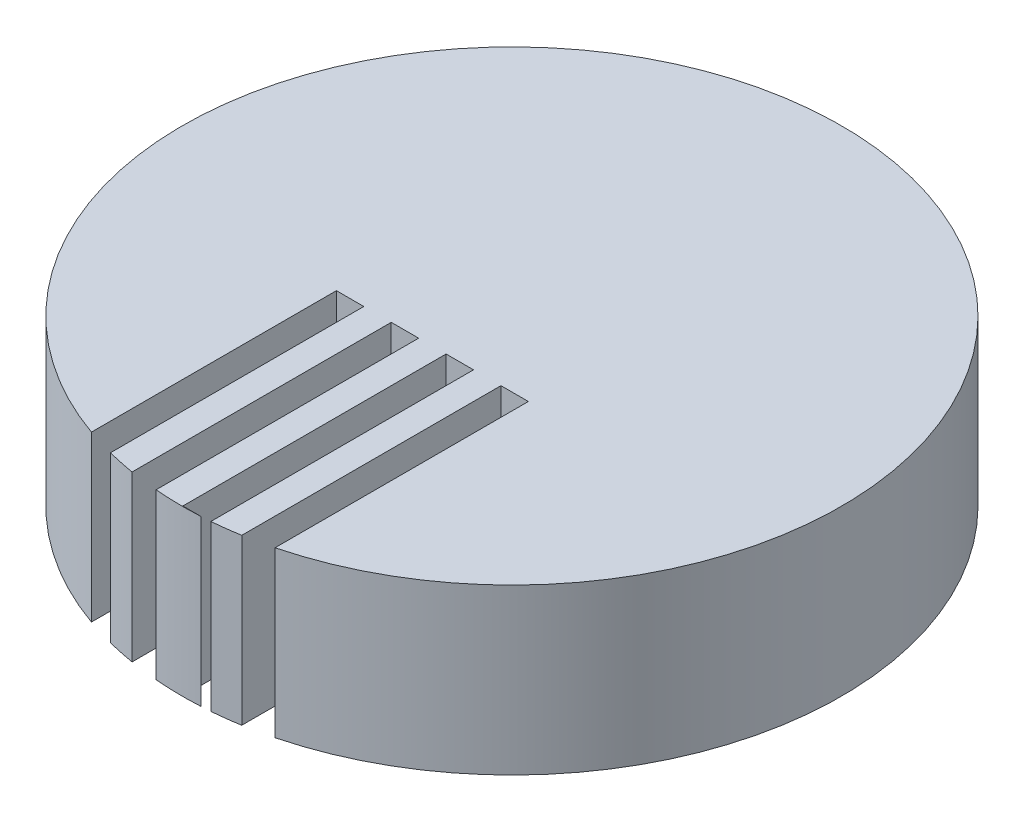
ISO-10303-21;
HEADER;
FILE_DESCRIPTION(('STEP AP214'),'2;1');
FILE_NAME('part.step','',(''),(''),'','','');
FILE_SCHEMA(('AUTOMOTIVE_DESIGN { 1 0 10303 214 1 1 1 1 }'));
ENDSEC;
DATA;
#1=APPLICATION_CONTEXT('core data for automotive mechanical design processes');
#2=APPLICATION_PROTOCOL_DEFINITION('international standard','automotive_design',2000,#1);
#3=PRODUCT_CONTEXT('',#1,'mechanical');
#4=PRODUCT('Part','Part','',(#3));
#5=PRODUCT_RELATED_PRODUCT_CATEGORY('part','',(#4));
#6=PRODUCT_DEFINITION_FORMATION('','',#4);
#7=PRODUCT_DEFINITION_CONTEXT('part definition',#1,'design');
#8=PRODUCT_DEFINITION('design','',#6,#7);
#9=PRODUCT_DEFINITION_SHAPE('','',#8);
#10=(LENGTH_UNIT() NAMED_UNIT(*) SI_UNIT(.MILLI.,.METRE.));
#11=(NAMED_UNIT(*) PLANE_ANGLE_UNIT() SI_UNIT($,.RADIAN.));
#12=(NAMED_UNIT(*) SI_UNIT($,.STERADIAN.) SOLID_ANGLE_UNIT());
#13=UNCERTAINTY_MEASURE_WITH_UNIT(LENGTH_MEASURE(1.E-05),#10,'distance_accuracy_value','');
#14=(GEOMETRIC_REPRESENTATION_CONTEXT(3) GLOBAL_UNCERTAINTY_ASSIGNED_CONTEXT((#13)) GLOBAL_UNIT_ASSIGNED_CONTEXT((#10,
#11,#12)) REPRESENTATION_CONTEXT('',''));
#15=CARTESIAN_POINT('',(0.,0.,0.));
#16=DIRECTION('',(0.,0.,1.));
#17=DIRECTION('',(1.,0.,0.));
#18=AXIS2_PLACEMENT_3D('',#15,#16,#17);
#19=CARTESIAN_POINT('',(0.,38.1,0.));
#20=DIRECTION('',(0.,-1.,0.));
#21=DIRECTION('',(0.,0.,-1.));
#22=AXIS2_PLACEMENT_3D('',#19,#20,#21);
#23=CYLINDRICAL_SURFACE('',#22,76.3165677787455);
#24=CARTESIAN_POINT('',(0.,0.,0.));
#25=DIRECTION('',(0.,1.,0.));
#26=DIRECTION('',(0.,0.,1.));
#27=AXIS2_PLACEMENT_3D('',#24,#25,#26);
#28=CIRCLE('',#27,76.3165677787455);
#29=CARTESIAN_POINT('',(19.05,0.,73.9007173004962));
#30=VERTEX_POINT('',#29);
#31=CARTESIAN_POINT('',(-25.4,0.,71.965675967977));
#32=VERTEX_POINT('',#31);
#33=EDGE_CURVE('E230',#30,#32,#28,.T.);
#34=ORIENTED_EDGE('',*,*,#33,.T.);
#35=DIRECTION('',(0.,1.,0.));
#36=VECTOR('',#35,1.);
#37=CARTESIAN_POINT('',(-25.4,0.,71.965675967977));
#38=LINE('',#37,#36);
#39=CARTESIAN_POINT('',(-25.4,38.1,71.965675967977));
#40=VERTEX_POINT('',#39);
#41=EDGE_CURVE('E378',#32,#40,#38,.T.);
#42=ORIENTED_EDGE('',*,*,#41,.T.);
#43=CARTESIAN_POINT('',(0.,38.1,0.));
#44=DIRECTION('',(0.,1.,0.));
#45=DIRECTION('',(0.,0.,1.));
#46=AXIS2_PLACEMENT_3D('',#43,#44,#45);
#47=CIRCLE('',#46,76.3165677787455);
#48=CARTESIAN_POINT('',(19.05,38.1,73.9007173004962));
#49=VERTEX_POINT('',#48);
#50=EDGE_CURVE('E424',#49,#40,#47,.T.);
#51=ORIENTED_EDGE('',*,*,#50,.F.);
#52=DIRECTION('',(0.,1.,0.));
#53=VECTOR('',#52,1.);
#54=CARTESIAN_POINT('',(19.05,0.,73.9007173004962));
#55=LINE('',#54,#53);
#56=EDGE_CURVE('E331',#30,#49,#55,.T.);
#57=ORIENTED_EDGE('',*,*,#56,.F.);
#58=EDGE_LOOP('',(#34,#42,#51,#57));
#59=FACE_BOUND('',#58,.T.);
#60=ADVANCED_FACE('F39',(#59),#23,.T.);
#61=CARTESIAN_POINT('',(-6.35000000000001,38.1,76.0519297423008));
#62=VERTEX_POINT('',#61);
#63=CARTESIAN_POINT('',(4.2164579362137,38.1,76.2));
#64=VERTEX_POINT('',#63);
#65=EDGE_CURVE('E240',#62,#64,#47,.T.);
#66=ORIENTED_EDGE('',*,*,#65,.F.);
#67=DIRECTION('',(0.,1.,0.));
#68=VECTOR('',#67,1.);
#69=CARTESIAN_POINT('',(-6.35000000000001,0.,76.0519297423008));
#70=LINE('',#69,#68);
#71=CARTESIAN_POINT('',(-6.35000000000001,0.,76.0519297423008));
#72=VERTEX_POINT('',#71);
#73=EDGE_CURVE('E397',#72,#62,#70,.T.);
#74=ORIENTED_EDGE('',*,*,#73,.F.);
#75=CARTESIAN_POINT('',(4.2164579362137,0.,76.2));
#76=VERTEX_POINT('',#75);
#77=EDGE_CURVE('E231',#72,#76,#28,.T.);
#78=ORIENTED_EDGE('',*,*,#77,.T.);
#79=DIRECTION('',(0.,-1.,0.));
#80=VECTOR('',#79,1.);
#81=CARTESIAN_POINT('',(4.21645793621422,38.1,76.2));
#82=LINE('',#81,#80);
#83=EDGE_CURVE('E236',#76,#64,#82,.F.);
#84=ORIENTED_EDGE('',*,*,#83,.T.);
#85=EDGE_LOOP('',(#66,#74,#78,#84));
#86=FACE_BOUND('',#85,.T.);
#87=ADVANCED_FACE('F463',(#86),#23,.T.);
#88=CARTESIAN_POINT('',(-19.05,38.1,73.9007173004962));
#89=VERTEX_POINT('',#88);
#90=CARTESIAN_POINT('',(-12.7,38.1,75.252431970853));
#91=VERTEX_POINT('',#90);
#92=EDGE_CURVE('E223',#89,#91,#47,.T.);
#93=ORIENTED_EDGE('',*,*,#92,.F.);
#94=DIRECTION('',(0.,1.,0.));
#95=VECTOR('',#94,1.);
#96=CARTESIAN_POINT('',(-19.05,0.,73.9007173004962));
#97=LINE('',#96,#95);
#98=CARTESIAN_POINT('',(-19.05,0.,73.9007173004962));
#99=VERTEX_POINT('',#98);
#100=EDGE_CURVE('E208',#99,#89,#97,.T.);
#101=ORIENTED_EDGE('',*,*,#100,.F.);
#102=CARTESIAN_POINT('',(-12.7,0.,75.252431970853));
#103=VERTEX_POINT('',#102);
#104=EDGE_CURVE('E221',#99,#103,#28,.T.);
#105=ORIENTED_EDGE('',*,*,#104,.T.);
#106=DIRECTION('',(0.,1.,0.));
#107=VECTOR('',#106,1.);
#108=CARTESIAN_POINT('',(-12.7,0.,75.252431970853));
#109=LINE('',#108,#107);
#110=EDGE_CURVE('E318',#103,#91,#109,.T.);
#111=ORIENTED_EDGE('',*,*,#110,.T.);
#112=EDGE_LOOP('',(#93,#101,#105,#111));
#113=FACE_BOUND('',#112,.T.);
#114=ADVANCED_FACE('F219',(#113),#23,.T.);
#115=CARTESIAN_POINT('',(6.34999999999999,0.,76.0519297423008));
#116=VERTEX_POINT('',#115);
#117=CARTESIAN_POINT('',(12.7,0.,75.252431970853));
#118=VERTEX_POINT('',#117);
#119=EDGE_CURVE('E234',#116,#118,#28,.T.);
#120=ORIENTED_EDGE('',*,*,#119,.T.);
#121=DIRECTION('',(0.,1.,0.));
#122=VECTOR('',#121,1.);
#123=CARTESIAN_POINT('',(12.7,0.,75.252431970853));
#124=LINE('',#123,#122);
#125=CARTESIAN_POINT('',(12.7,38.1,75.252431970853));
#126=VERTEX_POINT('',#125);
#127=EDGE_CURVE('E328',#118,#126,#124,.T.);
#128=ORIENTED_EDGE('',*,*,#127,.T.);
#129=CARTESIAN_POINT('',(6.34999999999999,38.1,76.0519297423008));
#130=VERTEX_POINT('',#129);
#131=EDGE_CURVE('E243',#130,#126,#47,.T.);
#132=ORIENTED_EDGE('',*,*,#131,.F.);
#133=DIRECTION('',(0.,-1.,0.));
#134=VECTOR('',#133,1.);
#135=CARTESIAN_POINT('',(6.34999999999999,38.1,76.0519297423008));
#136=LINE('',#135,#134);
#137=EDGE_CURVE('E377',#116,#130,#136,.F.);
#138=ORIENTED_EDGE('',*,*,#137,.F.);
#139=EDGE_LOOP('',(#120,#128,#132,#138));
#140=FACE_BOUND('',#139,.T.);
#141=ADVANCED_FACE('F445',(#140),#23,.T.);
#142=CARTESIAN_POINT('',(0.,38.1,0.));
#143=DIRECTION('',(0.,1.,0.));
#144=DIRECTION('',(0.,0.,1.));
#145=AXIS2_PLACEMENT_3D('',#142,#143,#144);
#146=PLANE('',#145);
#147=DIRECTION('',(0.,0.,1.));
#148=VECTOR('',#147,1.);
#149=CARTESIAN_POINT('',(-25.4,38.1,0.));
#150=LINE('',#149,#148);
#151=CARTESIAN_POINT('',(-25.4,38.1,15.24));
#152=VERTEX_POINT('',#151);
#153=EDGE_CURVE('E390',#152,#40,#150,.T.);
#154=ORIENTED_EDGE('',*,*,#153,.F.);
#155=DIRECTION('',(1.,0.,0.));
#156=VECTOR('',#155,1.);
#157=CARTESIAN_POINT('',(0.,38.1,15.24));
#158=LINE('',#157,#156);
#159=CARTESIAN_POINT('',(-19.05,38.1,15.24));
#160=VERTEX_POINT('',#159);
#161=EDGE_CURVE('E410',#152,#160,#158,.T.);
#162=ORIENTED_EDGE('',*,*,#161,.T.);
#163=DIRECTION('',(0.,0.,-1.));
#164=VECTOR('',#163,1.);
#165=CARTESIAN_POINT('',(-19.05,38.1,0.));
#166=LINE('',#165,#164);
#167=EDGE_CURVE('E405',#89,#160,#166,.T.);
#168=ORIENTED_EDGE('',*,*,#167,.F.);
#169=ORIENTED_EDGE('',*,*,#92,.T.);
#170=DIRECTION('',(0.,0.,1.));
#171=VECTOR('',#170,1.);
#172=CARTESIAN_POINT('',(-12.7,38.1,0.));
#173=LINE('',#172,#171);
#174=CARTESIAN_POINT('',(-12.7,38.1,15.24));
#175=VERTEX_POINT('',#174);
#176=EDGE_CURVE('E402',#175,#91,#173,.T.);
#177=ORIENTED_EDGE('',*,*,#176,.F.);
#178=DIRECTION('',(1.,0.,0.));
#179=VECTOR('',#178,1.);
#180=CARTESIAN_POINT('',(0.,38.1,15.24));
#181=LINE('',#180,#179);
#182=CARTESIAN_POINT('',(-6.35000000000001,38.1,15.24));
#183=VERTEX_POINT('',#182);
#184=EDGE_CURVE('E403',#175,#183,#181,.T.);
#185=ORIENTED_EDGE('',*,*,#184,.T.);
#186=DIRECTION('',(0.,0.,-1.));
#187=VECTOR('',#186,1.);
#188=CARTESIAN_POINT('',(-6.35000000000001,38.1,0.));
#189=LINE('',#188,#187);
#190=EDGE_CURVE('E324',#62,#183,#189,.T.);
#191=ORIENTED_EDGE('',*,*,#190,.F.);
#192=ORIENTED_EDGE('',*,*,#65,.T.);
#193=DIRECTION('',(1.,0.,0.));
#194=VECTOR('',#193,1.);
#195=CARTESIAN_POINT('',(0.,38.1,76.2));
#196=LINE('',#195,#194);
#197=CARTESIAN_POINT('',(0.,38.1,76.2));
#198=VERTEX_POINT('',#197);
#199=EDGE_CURVE('E363',#198,#64,#196,.T.);
#200=ORIENTED_EDGE('',*,*,#199,.F.);
#201=DIRECTION('',(0.,0.,1.));
#202=VECTOR('',#201,1.);
#203=CARTESIAN_POINT('',(0.,38.1,15.24));
#204=LINE('',#203,#202);
#205=CARTESIAN_POINT('',(0.,38.1,15.24));
#206=VERTEX_POINT('',#205);
#207=EDGE_CURVE('E360',#206,#198,#204,.T.);
#208=ORIENTED_EDGE('',*,*,#207,.F.);
#209=DIRECTION('',(1.,0.,0.));
#210=VECTOR('',#209,1.);
#211=CARTESIAN_POINT('',(0.,38.1,15.24));
#212=LINE('',#211,#210);
#213=CARTESIAN_POINT('',(6.34999999999998,38.1,15.24));
#214=VERTEX_POINT('',#213);
#215=EDGE_CURVE('E336',#206,#214,#212,.T.);
#216=ORIENTED_EDGE('',*,*,#215,.T.);
#217=DIRECTION('',(0.,0.,1.));
#218=VECTOR('',#217,1.);
#219=CARTESIAN_POINT('',(6.34999999999998,38.1,15.24));
#220=LINE('',#219,#218);
#221=EDGE_CURVE('E366',#214,#130,#220,.T.);
#222=ORIENTED_EDGE('',*,*,#221,.T.);
#223=ORIENTED_EDGE('',*,*,#131,.T.);
#224=DIRECTION('',(0.,0.,1.));
#225=VECTOR('',#224,1.);
#226=CARTESIAN_POINT('',(12.7,38.1,0.));
#227=LINE('',#226,#225);
#228=CARTESIAN_POINT('',(12.7,38.1,15.24));
#229=VERTEX_POINT('',#228);
#230=EDGE_CURVE('E340',#229,#126,#227,.T.);
#231=ORIENTED_EDGE('',*,*,#230,.F.);
#232=DIRECTION('',(1.,0.,0.));
#233=VECTOR('',#232,1.);
#234=CARTESIAN_POINT('',(0.,38.1,15.24));
#235=LINE('',#234,#233);
#236=CARTESIAN_POINT('',(19.05,38.1,15.24));
#237=VERTEX_POINT('',#236);
#238=EDGE_CURVE('E343',#229,#237,#235,.T.);
#239=ORIENTED_EDGE('',*,*,#238,.T.);
#240=DIRECTION('',(0.,0.,1.));
#241=VECTOR('',#240,1.);
#242=CARTESIAN_POINT('',(19.05,38.1,0.));
#243=LINE('',#242,#241);
#244=EDGE_CURVE('E337',#237,#49,#243,.T.);
#245=ORIENTED_EDGE('',*,*,#244,.T.);
#246=ORIENTED_EDGE('',*,*,#50,.T.);
#247=EDGE_LOOP('',(#154,#162,#168,#169,#177,#185,#191,#192,#200,#208,#216,#222,#223,#231,#239,
#245,#246));
#248=FACE_BOUND('',#247,.T.);
#249=ADVANCED_FACE('F429',(#248),#146,.T.);
#250=CARTESIAN_POINT('',(0.,0.,0.));
#251=DIRECTION('',(0.,1.,0.));
#252=DIRECTION('',(0.,0.,1.));
#253=AXIS2_PLACEMENT_3D('',#250,#251,#252);
#254=PLANE('',#253);
#255=CARTESIAN_POINT('',(0.,0.,40.64));
#256=DIRECTION('',(0.,1.,0.));
#257=DIRECTION('',(-1.,0.,0.));
#258=AXIS2_PLACEMENT_3D('',#255,#256,#257);
#259=CIRCLE('',#258,25.4430624871263);
#260=CARTESIAN_POINT('',(-25.4,0.,39.1603281702314));
#261=VERTEX_POINT('',#260);
#262=CARTESIAN_POINT('',(-25.4,0.,42.1196718297686));
#263=VERTEX_POINT('',#262);
#264=EDGE_CURVE('E244',#261,#263,#259,.T.);
#265=ORIENTED_EDGE('',*,*,#264,.T.);
#266=DIRECTION('',(0.,0.,1.));
#267=VECTOR('',#266,1.);
#268=CARTESIAN_POINT('',(-25.4,0.,0.));
#269=LINE('',#268,#267);
#270=EDGE_CURVE('E416',#263,#32,#269,.T.);
#271=ORIENTED_EDGE('',*,*,#270,.T.);
#272=ORIENTED_EDGE('',*,*,#33,.F.);
#273=DIRECTION('',(0.,0.,1.));
#274=VECTOR('',#273,1.);
#275=CARTESIAN_POINT('',(19.05,0.,0.));
#276=LINE('',#275,#274);
#277=CARTESIAN_POINT('',(19.05,0.,57.5055545038938));
#278=VERTEX_POINT('',#277);
#279=EDGE_CURVE('E327',#278,#30,#276,.T.);
#280=ORIENTED_EDGE('',*,*,#279,.F.);
#281=CARTESIAN_POINT('',(19.05,0.,23.7744454961062));
#282=VERTEX_POINT('',#281);
#283=EDGE_CURVE('E290',#278,#282,#259,.T.);
#284=ORIENTED_EDGE('',*,*,#283,.T.);
#285=CARTESIAN_POINT('',(19.05,0.,15.24));
#286=VERTEX_POINT('',#285);
#287=EDGE_CURVE('E347',#286,#282,#276,.T.);
#288=ORIENTED_EDGE('',*,*,#287,.F.);
#289=DIRECTION('',(1.,0.,0.));
#290=VECTOR('',#289,1.);
#291=CARTESIAN_POINT('',(0.,0.,15.24));
#292=LINE('',#291,#290);
#293=CARTESIAN_POINT('',(12.7,0.,15.24));
#294=VERTEX_POINT('',#293);
#295=EDGE_CURVE('E341',#294,#286,#292,.T.);
#296=ORIENTED_EDGE('',*,*,#295,.F.);
#297=DIRECTION('',(0.,0.,1.));
#298=VECTOR('',#297,1.);
#299=CARTESIAN_POINT('',(12.7,0.,0.));
#300=LINE('',#299,#298);
#301=CARTESIAN_POINT('',(12.7,0.,18.5932444853259));
#302=VERTEX_POINT('',#301);
#303=EDGE_CURVE('E349',#294,#302,#300,.T.);
#304=ORIENTED_EDGE('',*,*,#303,.T.);
#305=CARTESIAN_POINT('',(6.34999999999998,0.,16.0020835149599));
#306=VERTEX_POINT('',#305);
#307=EDGE_CURVE('E295',#302,#306,#259,.T.);
#308=ORIENTED_EDGE('',*,*,#307,.T.);
#309=DIRECTION('',(0.,0.,1.));
#310=VECTOR('',#309,1.);
#311=CARTESIAN_POINT('',(6.34999999999998,0.,15.24));
#312=LINE('',#311,#310);
#313=CARTESIAN_POINT('',(6.34999999999998,0.,15.24));
#314=VERTEX_POINT('',#313);
#315=EDGE_CURVE('E375',#314,#306,#312,.T.);
#316=ORIENTED_EDGE('',*,*,#315,.F.);
#317=DIRECTION('',(1.,0.,0.));
#318=VECTOR('',#317,1.);
#319=CARTESIAN_POINT('',(0.,0.,15.24));
#320=LINE('',#319,#318);
#321=CARTESIAN_POINT('',(1.47967182976872,0.,15.24));
#322=VERTEX_POINT('',#321);
#323=EDGE_CURVE('E364',#322,#314,#320,.T.);
#324=ORIENTED_EDGE('',*,*,#323,.F.);
#325=CARTESIAN_POINT('',(-6.35000000000001,0.,16.0020835149599));
#326=VERTEX_POINT('',#325);
#327=EDGE_CURVE('E301',#322,#326,#259,.T.);
#328=ORIENTED_EDGE('',*,*,#327,.T.);
#329=DIRECTION('',(0.,0.,-1.));
#330=VECTOR('',#329,1.);
#331=CARTESIAN_POINT('',(-6.35000000000001,0.,0.));
#332=LINE('',#331,#330);
#333=CARTESIAN_POINT('',(-6.35000000000001,0.,15.24));
#334=VERTEX_POINT('',#333);
#335=EDGE_CURVE('E273',#326,#334,#332,.T.);
#336=ORIENTED_EDGE('',*,*,#335,.T.);
#337=DIRECTION('',(1.,0.,0.));
#338=VECTOR('',#337,1.);
#339=CARTESIAN_POINT('',(0.,0.,15.24));
#340=LINE('',#339,#338);
#341=CARTESIAN_POINT('',(-12.7,0.,15.24));
#342=VERTEX_POINT('',#341);
#343=EDGE_CURVE('E320',#342,#334,#340,.T.);
#344=ORIENTED_EDGE('',*,*,#343,.F.);
#345=DIRECTION('',(0.,0.,1.));
#346=VECTOR('',#345,1.);
#347=CARTESIAN_POINT('',(-12.7,0.,0.));
#348=LINE('',#347,#346);
#349=CARTESIAN_POINT('',(-12.7,0.,18.5932444853259));
#350=VERTEX_POINT('',#349);
#351=EDGE_CURVE('E312',#342,#350,#348,.T.);
#352=ORIENTED_EDGE('',*,*,#351,.T.);
#353=CARTESIAN_POINT('',(-19.05,0.,23.7744454961062));
#354=VERTEX_POINT('',#353);
#355=EDGE_CURVE('E247',#350,#354,#259,.T.);
#356=ORIENTED_EDGE('',*,*,#355,.T.);
#357=DIRECTION('',(0.,0.,-1.));
#358=VECTOR('',#357,1.);
#359=CARTESIAN_POINT('',(-19.05,0.,0.));
#360=LINE('',#359,#358);
#361=CARTESIAN_POINT('',(-19.05,0.,15.24));
#362=VERTEX_POINT('',#361);
#363=EDGE_CURVE('E54',#354,#362,#360,.T.);
#364=ORIENTED_EDGE('',*,*,#363,.T.);
#365=DIRECTION('',(1.,0.,0.));
#366=VECTOR('',#365,1.);
#367=CARTESIAN_POINT('',(0.,0.,15.24));
#368=LINE('',#367,#366);
#369=CARTESIAN_POINT('',(-25.4,0.,15.24));
#370=VERTEX_POINT('',#369);
#371=EDGE_CURVE('E214',#370,#362,#368,.T.);
#372=ORIENTED_EDGE('',*,*,#371,.F.);
#373=EDGE_CURVE('E225',#370,#261,#269,.T.);
#374=ORIENTED_EDGE('',*,*,#373,.T.);
#375=EDGE_LOOP('',(#265,#271,#272,#280,#284,#288,#296,#304,#308,#316,#324,#328,#336,#344,#352,
#356,#364,#372,#374));
#376=FACE_BOUND('',#375,.T.);
#377=ADVANCED_FACE('F41',(#376),#254,.F.);
#378=ORIENTED_EDGE('',*,*,#77,.F.);
#379=CARTESIAN_POINT('',(-6.35000000000001,0.,65.2779164850401));
#380=VERTEX_POINT('',#379);
#381=EDGE_CURVE('E269',#72,#380,#332,.T.);
#382=ORIENTED_EDGE('',*,*,#381,.T.);
#383=CARTESIAN_POINT('',(0.,0.,66.0830624871263));
#384=VERTEX_POINT('',#383);
#385=EDGE_CURVE('E283',#380,#384,#259,.T.);
#386=ORIENTED_EDGE('',*,*,#385,.T.);
#387=DIRECTION('',(0.,0.,1.));
#388=VECTOR('',#387,1.);
#389=CARTESIAN_POINT('',(0.,0.,15.24));
#390=LINE('',#389,#388);
#391=CARTESIAN_POINT('',(0.,0.,76.2));
#392=VERTEX_POINT('',#391);
#393=EDGE_CURVE('E359',#384,#392,#390,.T.);
#394=ORIENTED_EDGE('',*,*,#393,.T.);
#395=DIRECTION('',(1.,0.,0.));
#396=VECTOR('',#395,1.);
#397=CARTESIAN_POINT('',(0.,0.,76.2));
#398=LINE('',#397,#396);
#399=EDGE_CURVE('E372',#392,#76,#398,.T.);
#400=ORIENTED_EDGE('',*,*,#399,.T.);
#401=EDGE_LOOP('',(#378,#382,#386,#394,#400));
#402=FACE_BOUND('',#401,.T.);
#403=ADVANCED_FACE('F281',(#402),#254,.F.);
#404=ORIENTED_EDGE('',*,*,#104,.F.);
#405=CARTESIAN_POINT('',(-19.05,0.,57.5055545038938));
#406=VERTEX_POINT('',#405);
#407=EDGE_CURVE('E204',#99,#406,#360,.T.);
#408=ORIENTED_EDGE('',*,*,#407,.T.);
#409=CARTESIAN_POINT('',(-12.7,0.,62.6867555146741));
#410=VERTEX_POINT('',#409);
#411=EDGE_CURVE('E248',#406,#410,#259,.T.);
#412=ORIENTED_EDGE('',*,*,#411,.T.);
#413=EDGE_CURVE('E229',#410,#103,#348,.T.);
#414=ORIENTED_EDGE('',*,*,#413,.T.);
#415=EDGE_LOOP('',(#404,#408,#412,#414));
#416=FACE_BOUND('',#415,.T.);
#417=ADVANCED_FACE('F228',(#416),#254,.F.);
#418=CARTESIAN_POINT('',(6.34999999999999,0.,65.2779164850401));
#419=VERTEX_POINT('',#418);
#420=CARTESIAN_POINT('',(12.7,0.,62.6867555146741));
#421=VERTEX_POINT('',#420);
#422=EDGE_CURVE('E288',#419,#421,#259,.T.);
#423=ORIENTED_EDGE('',*,*,#422,.T.);
#424=EDGE_CURVE('E62',#421,#118,#300,.T.);
#425=ORIENTED_EDGE('',*,*,#424,.T.);
#426=ORIENTED_EDGE('',*,*,#119,.F.);
#427=EDGE_CURVE('E374',#419,#116,#312,.T.);
#428=ORIENTED_EDGE('',*,*,#427,.F.);
#429=EDGE_LOOP('',(#423,#425,#426,#428));
#430=FACE_BOUND('',#429,.T.);
#431=ADVANCED_FACE('F442',(#430),#254,.F.);
#432=CARTESIAN_POINT('',(0.,0.,40.64));
#433=DIRECTION('',(0.,1.,0.));
#434=DIRECTION('',(1.,0.,0.));
#435=AXIS2_PLACEMENT_3D('',#432,#433,#434);
#436=SPHERICAL_SURFACE('',#435,25.4430624871263);
#437=CARTESIAN_POINT('',(-25.4,0.,40.64));
#438=DIRECTION('',(-1.,0.,0.));
#439=DIRECTION('',(0.,0.,1.));
#440=AXIS2_PLACEMENT_3D('',#437,#438,#439);
#441=CIRCLE('',#440,1.47967182976879);
#442=EDGE_CURVE('E11',#263,#261,#441,.T.);
#443=ORIENTED_EDGE('',*,*,#442,.F.);
#444=ORIENTED_EDGE('',*,*,#264,.F.);
#445=EDGE_LOOP('',(#443,#444));
#446=FACE_BOUND('',#445,.T.);
#447=ADVANCED_FACE('F452',(#446),#436,.F.);
#448=CARTESIAN_POINT('',(-6.35000000000001,0.,40.64));
#449=DIRECTION('',(1.,0.,0.));
#450=DIRECTION('',(0.,0.,-1.));
#451=AXIS2_PLACEMENT_3D('',#448,#449,#450);
#452=CIRCLE('',#451,24.6379164850401);
#453=EDGE_CURVE('E264',#326,#380,#452,.T.);
#454=ORIENTED_EDGE('',*,*,#453,.F.);
#455=ORIENTED_EDGE('',*,*,#327,.F.);
#456=CARTESIAN_POINT('',(0.,0.,15.24));
#457=DIRECTION('',(0.,0.,1.));
#458=DIRECTION('',(1.,0.,0.));
#459=AXIS2_PLACEMENT_3D('',#456,#457,#458);
#460=CIRCLE('',#459,1.47967182976883);
#461=CARTESIAN_POINT('',(0.,1.47967182976879,15.24));
#462=VERTEX_POINT('',#461);
#463=EDGE_CURVE('E251',#322,#462,#460,.T.);
#464=ORIENTED_EDGE('',*,*,#463,.T.);
#465=CARTESIAN_POINT('',(0.,0.,40.64));
#466=DIRECTION('',(-1.,0.,0.));
#467=DIRECTION('',(0.,0.,1.));
#468=AXIS2_PLACEMENT_3D('',#465,#466,#467);
#469=CIRCLE('',#468,25.4430624871263);
#470=EDGE_CURVE('E249',#384,#462,#469,.T.);
#471=ORIENTED_EDGE('',*,*,#470,.F.);
#472=ORIENTED_EDGE('',*,*,#385,.F.);
#473=EDGE_LOOP('',(#454,#455,#464,#471,#472));
#474=FACE_BOUND('',#473,.T.);
#475=ADVANCED_FACE('F287',(#474),#436,.F.);
#476=ORIENTED_EDGE('',*,*,#283,.F.);
#477=CARTESIAN_POINT('',(19.05,0.,40.64));
#478=DIRECTION('',(-1.,0.,0.));
#479=DIRECTION('',(0.,0.,1.));
#480=AXIS2_PLACEMENT_3D('',#477,#478,#479);
#481=CIRCLE('',#480,16.8655545038938);
#482=EDGE_CURVE('E259',#278,#282,#481,.T.);
#483=ORIENTED_EDGE('',*,*,#482,.T.);
#484=EDGE_LOOP('',(#476,#483));
#485=FACE_BOUND('',#484,.T.);
#486=ADVANCED_FACE('F458',(#485),#436,.F.);
#487=CARTESIAN_POINT('',(12.7,0.,40.64));
#488=DIRECTION('',(-1.,0.,0.));
#489=DIRECTION('',(0.,0.,1.));
#490=AXIS2_PLACEMENT_3D('',#487,#488,#489);
#491=CIRCLE('',#490,22.0467555146741);
#492=EDGE_CURVE('E257',#421,#302,#491,.T.);
#493=ORIENTED_EDGE('',*,*,#492,.F.);
#494=ORIENTED_EDGE('',*,*,#422,.F.);
#495=CARTESIAN_POINT('',(6.34999999999999,0.,40.64));
#496=DIRECTION('',(-1.,0.,0.));
#497=DIRECTION('',(0.,0.,1.));
#498=AXIS2_PLACEMENT_3D('',#495,#496,#497);
#499=CIRCLE('',#498,24.6379164850401);
#500=EDGE_CURVE('E254',#419,#306,#499,.T.);
#501=ORIENTED_EDGE('',*,*,#500,.T.);
#502=ORIENTED_EDGE('',*,*,#307,.F.);
#503=EDGE_LOOP('',(#493,#494,#501,#502));
#504=FACE_BOUND('',#503,.T.);
#505=ADVANCED_FACE('F438',(#504),#436,.F.);
#506=CARTESIAN_POINT('',(-19.05,0.,40.64));
#507=DIRECTION('',(1.,0.,0.));
#508=DIRECTION('',(0.,0.,-1.));
#509=AXIS2_PLACEMENT_3D('',#506,#507,#508);
#510=CIRCLE('',#509,16.8655545038938);
#511=EDGE_CURVE('E47',#354,#406,#510,.T.);
#512=ORIENTED_EDGE('',*,*,#511,.F.);
#513=ORIENTED_EDGE('',*,*,#355,.F.);
#514=CARTESIAN_POINT('',(-12.7,0.,40.64));
#515=DIRECTION('',(-1.,0.,0.));
#516=DIRECTION('',(0.,0.,1.));
#517=AXIS2_PLACEMENT_3D('',#514,#515,#516);
#518=CIRCLE('',#517,22.0467555146741);
#519=EDGE_CURVE('E262',#410,#350,#518,.T.);
#520=ORIENTED_EDGE('',*,*,#519,.F.);
#521=ORIENTED_EDGE('',*,*,#411,.F.);
#522=EDGE_LOOP('',(#512,#513,#520,#521));
#523=FACE_BOUND('',#522,.T.);
#524=ADVANCED_FACE('F315',(#523),#436,.F.);
#525=CARTESIAN_POINT('',(0.,0.,76.2));
#526=DIRECTION('',(0.,0.,1.));
#527=DIRECTION('',(1.,0.,0.));
#528=AXIS2_PLACEMENT_3D('',#525,#526,#527);
#529=PLANE('',#528);
#530=ORIENTED_EDGE('',*,*,#399,.F.);
#531=DIRECTION('',(0.,1.,0.));
#532=VECTOR('',#531,1.);
#533=CARTESIAN_POINT('',(0.,0.,76.2));
#534=LINE('',#533,#532);
#535=EDGE_CURVE('E355',#392,#198,#534,.T.);
#536=ORIENTED_EDGE('',*,*,#535,.T.);
#537=ORIENTED_EDGE('',*,*,#199,.T.);
#538=ORIENTED_EDGE('',*,*,#83,.F.);
#539=EDGE_LOOP('',(#530,#536,#537,#538));
#540=FACE_BOUND('',#539,.T.);
#541=ADVANCED_FACE('F461',(#540),#529,.F.);
#542=CARTESIAN_POINT('',(6.34999999999998,0.,15.24));
#543=DIRECTION('',(-1.,0.,0.));
#544=DIRECTION('',(0.,0.,1.));
#545=AXIS2_PLACEMENT_3D('',#542,#543,#544);
#546=PLANE('',#545);
#547=ORIENTED_EDGE('',*,*,#137,.T.);
#548=ORIENTED_EDGE('',*,*,#221,.F.);
#549=DIRECTION('',(0.,1.,0.));
#550=VECTOR('',#549,1.);
#551=CARTESIAN_POINT('',(6.34999999999998,0.,15.24));
#552=LINE('',#551,#550);
#553=EDGE_CURVE('E352',#314,#214,#552,.T.);
#554=ORIENTED_EDGE('',*,*,#553,.F.);
#555=ORIENTED_EDGE('',*,*,#315,.T.);
#556=ORIENTED_EDGE('',*,*,#500,.F.);
#557=ORIENTED_EDGE('',*,*,#427,.T.);
#558=EDGE_LOOP('',(#547,#548,#554,#555,#556,#557));
#559=FACE_BOUND('',#558,.T.);
#560=ADVANCED_FACE('F439',(#559),#546,.T.);
#561=CARTESIAN_POINT('',(0.,0.,15.24));
#562=DIRECTION('',(0.,0.,1.));
#563=DIRECTION('',(1.,0.,0.));
#564=AXIS2_PLACEMENT_3D('',#561,#562,#563);
#565=PLANE('',#564);
#566=ORIENTED_EDGE('',*,*,#323,.T.);
#567=ORIENTED_EDGE('',*,*,#553,.T.);
#568=ORIENTED_EDGE('',*,*,#215,.F.);
#569=DIRECTION('',(0.,1.,0.));
#570=VECTOR('',#569,1.);
#571=CARTESIAN_POINT('',(0.,0.,15.24));
#572=LINE('',#571,#570);
#573=EDGE_CURVE('E357',#462,#206,#572,.T.);
#574=ORIENTED_EDGE('',*,*,#573,.F.);
#575=ORIENTED_EDGE('',*,*,#463,.F.);
#576=EDGE_LOOP('',(#566,#567,#568,#574,#575));
#577=FACE_BOUND('',#576,.T.);
#578=ADVANCED_FACE('F504',(#577),#565,.T.);
#579=CARTESIAN_POINT('',(0.,0.,15.24));
#580=DIRECTION('',(-1.,0.,0.));
#581=DIRECTION('',(0.,0.,1.));
#582=AXIS2_PLACEMENT_3D('',#579,#580,#581);
#583=PLANE('',#582);
#584=ORIENTED_EDGE('',*,*,#470,.T.);
#585=ORIENTED_EDGE('',*,*,#573,.T.);
#586=ORIENTED_EDGE('',*,*,#207,.T.);
#587=ORIENTED_EDGE('',*,*,#535,.F.);
#588=ORIENTED_EDGE('',*,*,#393,.F.);
#589=EDGE_LOOP('',(#584,#585,#586,#587,#588));
#590=FACE_BOUND('',#589,.T.);
#591=ADVANCED_FACE('F512',(#590),#583,.F.);
#592=CARTESIAN_POINT('',(0.,0.,15.24));
#593=DIRECTION('',(0.,0.,1.));
#594=DIRECTION('',(1.,0.,0.));
#595=AXIS2_PLACEMENT_3D('',#592,#593,#594);
#596=PLANE('',#595);
#597=ORIENTED_EDGE('',*,*,#238,.F.);
#598=DIRECTION('',(0.,1.,0.));
#599=VECTOR('',#598,1.);
#600=CARTESIAN_POINT('',(12.7,0.,15.24));
#601=LINE('',#600,#599);
#602=EDGE_CURVE('E325',#294,#229,#601,.T.);
#603=ORIENTED_EDGE('',*,*,#602,.F.);
#604=ORIENTED_EDGE('',*,*,#295,.T.);
#605=DIRECTION('',(0.,1.,0.));
#606=VECTOR('',#605,1.);
#607=CARTESIAN_POINT('',(19.05,0.,15.24));
#608=LINE('',#607,#606);
#609=EDGE_CURVE('E333',#286,#237,#608,.T.);
#610=ORIENTED_EDGE('',*,*,#609,.T.);
#611=EDGE_LOOP('',(#597,#603,#604,#610));
#612=FACE_BOUND('',#611,.T.);
#613=ADVANCED_FACE('F434',(#612),#596,.T.);
#614=CARTESIAN_POINT('',(19.05,0.,0.));
#615=DIRECTION('',(-1.,0.,0.));
#616=DIRECTION('',(0.,0.,1.));
#617=AXIS2_PLACEMENT_3D('',#614,#615,#616);
#618=PLANE('',#617);
#619=ORIENTED_EDGE('',*,*,#279,.T.);
#620=ORIENTED_EDGE('',*,*,#56,.T.);
#621=ORIENTED_EDGE('',*,*,#244,.F.);
#622=ORIENTED_EDGE('',*,*,#609,.F.);
#623=ORIENTED_EDGE('',*,*,#287,.T.);
#624=ORIENTED_EDGE('',*,*,#482,.F.);
#625=EDGE_LOOP('',(#619,#620,#621,#622,#623,#624));
#626=FACE_BOUND('',#625,.T.);
#627=ADVANCED_FACE('F426',(#626),#618,.T.);
#628=CARTESIAN_POINT('',(12.7,0.,0.));
#629=DIRECTION('',(-1.,0.,0.));
#630=DIRECTION('',(0.,0.,1.));
#631=AXIS2_PLACEMENT_3D('',#628,#629,#630);
#632=PLANE('',#631);
#633=ORIENTED_EDGE('',*,*,#492,.T.);
#634=ORIENTED_EDGE('',*,*,#303,.F.);
#635=ORIENTED_EDGE('',*,*,#602,.T.);
#636=ORIENTED_EDGE('',*,*,#230,.T.);
#637=ORIENTED_EDGE('',*,*,#127,.F.);
#638=ORIENTED_EDGE('',*,*,#424,.F.);
#639=EDGE_LOOP('',(#633,#634,#635,#636,#637,#638));
#640=FACE_BOUND('',#639,.T.);
#641=ADVANCED_FACE('F535',(#640),#632,.F.);
#642=CARTESIAN_POINT('',(0.,0.,15.24));
#643=DIRECTION('',(0.,0.,1.));
#644=DIRECTION('',(1.,0.,0.));
#645=AXIS2_PLACEMENT_3D('',#642,#643,#644);
#646=PLANE('',#645);
#647=ORIENTED_EDGE('',*,*,#184,.F.);
#648=DIRECTION('',(0.,1.,0.));
#649=VECTOR('',#648,1.);
#650=CARTESIAN_POINT('',(-12.7,0.,15.24));
#651=LINE('',#650,#649);
#652=EDGE_CURVE('E394',#342,#175,#651,.T.);
#653=ORIENTED_EDGE('',*,*,#652,.F.);
#654=ORIENTED_EDGE('',*,*,#343,.T.);
#655=DIRECTION('',(0.,1.,0.));
#656=VECTOR('',#655,1.);
#657=CARTESIAN_POINT('',(-6.35000000000001,0.,15.24));
#658=LINE('',#657,#656);
#659=EDGE_CURVE('E346',#334,#183,#658,.T.);
#660=ORIENTED_EDGE('',*,*,#659,.T.);
#661=EDGE_LOOP('',(#647,#653,#654,#660));
#662=FACE_BOUND('',#661,.T.);
#663=ADVANCED_FACE('F543',(#662),#646,.T.);
#664=CARTESIAN_POINT('',(-6.35000000000001,0.,0.));
#665=DIRECTION('',(1.,0.,0.));
#666=DIRECTION('',(0.,0.,-1.));
#667=AXIS2_PLACEMENT_3D('',#664,#665,#666);
#668=PLANE('',#667);
#669=ORIENTED_EDGE('',*,*,#453,.T.);
#670=ORIENTED_EDGE('',*,*,#381,.F.);
#671=ORIENTED_EDGE('',*,*,#73,.T.);
#672=ORIENTED_EDGE('',*,*,#190,.T.);
#673=ORIENTED_EDGE('',*,*,#659,.F.);
#674=ORIENTED_EDGE('',*,*,#335,.F.);
#675=EDGE_LOOP('',(#669,#670,#671,#672,#673,#674));
#676=FACE_BOUND('',#675,.T.);
#677=ADVANCED_FACE('F268',(#676),#668,.F.);
#678=CARTESIAN_POINT('',(-12.7,0.,0.));
#679=DIRECTION('',(-1.,0.,0.));
#680=DIRECTION('',(0.,0.,1.));
#681=AXIS2_PLACEMENT_3D('',#678,#679,#680);
#682=PLANE('',#681);
#683=ORIENTED_EDGE('',*,*,#519,.T.);
#684=ORIENTED_EDGE('',*,*,#351,.F.);
#685=ORIENTED_EDGE('',*,*,#652,.T.);
#686=ORIENTED_EDGE('',*,*,#176,.T.);
#687=ORIENTED_EDGE('',*,*,#110,.F.);
#688=ORIENTED_EDGE('',*,*,#413,.F.);
#689=EDGE_LOOP('',(#683,#684,#685,#686,#687,#688));
#690=FACE_BOUND('',#689,.T.);
#691=ADVANCED_FACE('F317',(#690),#682,.F.);
#692=CARTESIAN_POINT('',(-25.4,0.,0.));
#693=DIRECTION('',(-1.,0.,0.));
#694=DIRECTION('',(0.,0.,1.));
#695=AXIS2_PLACEMENT_3D('',#692,#693,#694);
#696=PLANE('',#695);
#697=ORIENTED_EDGE('',*,*,#442,.T.);
#698=ORIENTED_EDGE('',*,*,#373,.F.);
#699=DIRECTION('',(0.,1.,0.));
#700=VECTOR('',#699,1.);
#701=CARTESIAN_POINT('',(-25.4,0.,15.24));
#702=LINE('',#701,#700);
#703=EDGE_CURVE('E383',#370,#152,#702,.T.);
#704=ORIENTED_EDGE('',*,*,#703,.T.);
#705=ORIENTED_EDGE('',*,*,#153,.T.);
#706=ORIENTED_EDGE('',*,*,#41,.F.);
#707=ORIENTED_EDGE('',*,*,#270,.F.);
#708=EDGE_LOOP('',(#697,#698,#704,#705,#706,#707));
#709=FACE_BOUND('',#708,.T.);
#710=ADVANCED_FACE('F450',(#709),#696,.F.);
#711=CARTESIAN_POINT('',(0.,0.,15.24));
#712=DIRECTION('',(0.,0.,1.));
#713=DIRECTION('',(1.,0.,0.));
#714=AXIS2_PLACEMENT_3D('',#711,#712,#713);
#715=PLANE('',#714);
#716=ORIENTED_EDGE('',*,*,#161,.F.);
#717=ORIENTED_EDGE('',*,*,#703,.F.);
#718=ORIENTED_EDGE('',*,*,#371,.T.);
#719=DIRECTION('',(0.,1.,0.));
#720=VECTOR('',#719,1.);
#721=CARTESIAN_POINT('',(-19.05,0.,15.24));
#722=LINE('',#721,#720);
#723=EDGE_CURVE('E224',#362,#160,#722,.T.);
#724=ORIENTED_EDGE('',*,*,#723,.T.);
#725=EDGE_LOOP('',(#716,#717,#718,#724));
#726=FACE_BOUND('',#725,.T.);
#727=ADVANCED_FACE('F448',(#726),#715,.T.);
#728=CARTESIAN_POINT('',(-19.05,0.,0.));
#729=DIRECTION('',(1.,0.,0.));
#730=DIRECTION('',(0.,0.,-1.));
#731=AXIS2_PLACEMENT_3D('',#728,#729,#730);
#732=PLANE('',#731);
#733=ORIENTED_EDGE('',*,*,#511,.T.);
#734=ORIENTED_EDGE('',*,*,#407,.F.);
#735=ORIENTED_EDGE('',*,*,#100,.T.);
#736=ORIENTED_EDGE('',*,*,#167,.T.);
#737=ORIENTED_EDGE('',*,*,#723,.F.);
#738=ORIENTED_EDGE('',*,*,#363,.F.);
#739=EDGE_LOOP('',(#733,#734,#735,#736,#737,#738));
#740=FACE_BOUND('',#739,.T.);
#741=ADVANCED_FACE('F206',(#740),#732,.F.);
#742=CLOSED_SHELL('',(#60,#87,#114,#141,#249,#377,#403,#417,#431,#447,#475,#486,#505,#524,#541,
#560,#578,#591,#613,#627,#641,#663,#677,#691,#710,#727,#741));
#743=MANIFOLD_SOLID_BREP('B2',#742);
#744=ADVANCED_BREP_SHAPE_REPRESENTATION('',(#18,#743),#14);
#745=SHAPE_DEFINITION_REPRESENTATION(#9,#744);
ENDSEC;
END-ISO-10303-21;
